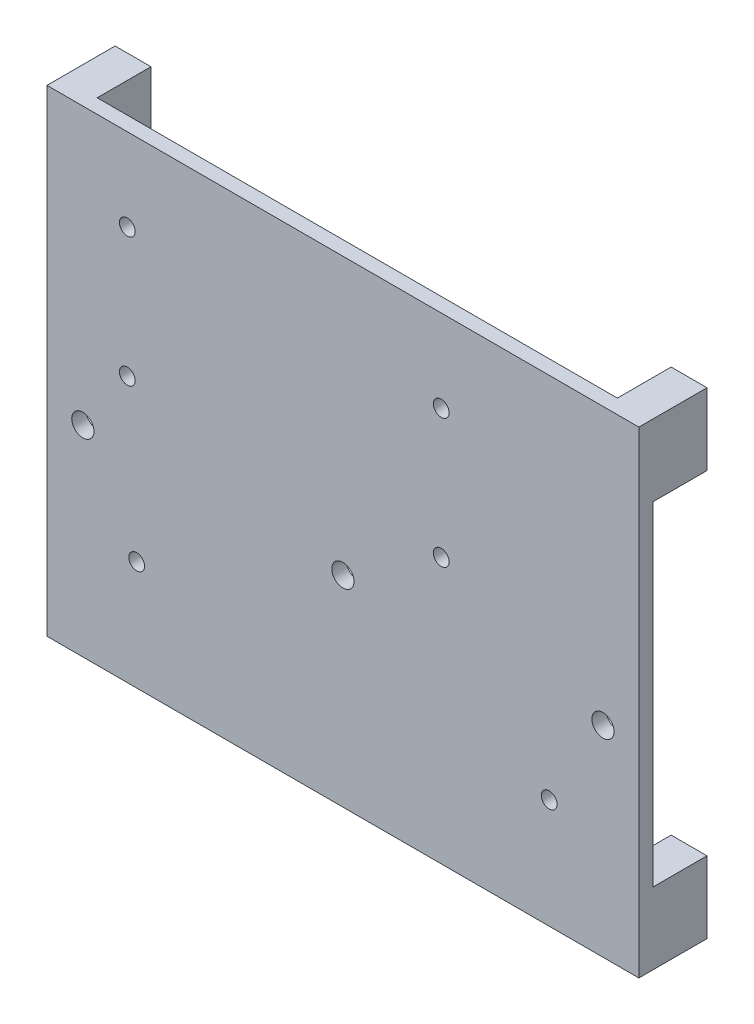
ISO-10303-21;
HEADER;
FILE_DESCRIPTION(('STEP AP214'),'2;1');
FILE_NAME('part.step','',(''),(''),'','','');
FILE_SCHEMA(('AUTOMOTIVE_DESIGN { 1 0 10303 214 1 1 1 1 }'));
ENDSEC;
DATA;
#1=APPLICATION_CONTEXT('core data for automotive mechanical design processes');
#2=APPLICATION_PROTOCOL_DEFINITION('international standard','automotive_design',2000,#1);
#3=PRODUCT_CONTEXT('',#1,'mechanical');
#4=PRODUCT('Part','Part','',(#3));
#5=PRODUCT_RELATED_PRODUCT_CATEGORY('part','',(#4));
#6=PRODUCT_DEFINITION_FORMATION('','',#4);
#7=PRODUCT_DEFINITION_CONTEXT('part definition',#1,'design');
#8=PRODUCT_DEFINITION('design','',#6,#7);
#9=PRODUCT_DEFINITION_SHAPE('','',#8);
#10=(LENGTH_UNIT() NAMED_UNIT(*) SI_UNIT(.MILLI.,.METRE.));
#11=(NAMED_UNIT(*) PLANE_ANGLE_UNIT() SI_UNIT($,.RADIAN.));
#12=(NAMED_UNIT(*) SI_UNIT($,.STERADIAN.) SOLID_ANGLE_UNIT());
#13=UNCERTAINTY_MEASURE_WITH_UNIT(LENGTH_MEASURE(1.E-05),#10,'distance_accuracy_value','');
#14=(GEOMETRIC_REPRESENTATION_CONTEXT(3) GLOBAL_UNCERTAINTY_ASSIGNED_CONTEXT((#13)) GLOBAL_UNIT_ASSIGNED_CONTEXT((#10,
#11,#12)) REPRESENTATION_CONTEXT('',''));
#15=CARTESIAN_POINT('',(0.,0.,0.));
#16=DIRECTION('',(0.,0.,1.));
#17=DIRECTION('',(1.,0.,0.));
#18=AXIS2_PLACEMENT_3D('',#15,#16,#17);
#19=CARTESIAN_POINT('',(0.,0.,0.));
#20=DIRECTION('',(0.,0.,-1.));
#21=DIRECTION('',(-1.,0.,0.));
#22=AXIS2_PLACEMENT_3D('',#19,#20,#21);
#23=PLANE('',#22);
#24=CARTESIAN_POINT('',(72.5,25.5,0.));
#25=DIRECTION('',(0.,0.,-1.));
#26=DIRECTION('',(-1.,0.,0.));
#27=AXIS2_PLACEMENT_3D('',#24,#25,#26);
#28=CIRCLE('',#27,3.1);
#29=CARTESIAN_POINT('',(69.4,25.5,0.));
#30=VERTEX_POINT('',#29);
#31=EDGE_CURVE('E625',#30,#30,#28,.T.);
#32=ORIENTED_EDGE('',*,*,#31,.F.);
#33=EDGE_LOOP('',(#32));
#34=FACE_BOUND('',#33,.T.);
#35=CARTESIAN_POINT('',(-72.5,25.5,0.));
#36=DIRECTION('',(0.,0.,-1.));
#37=DIRECTION('',(-1.,0.,0.));
#38=AXIS2_PLACEMENT_3D('',#35,#36,#37);
#39=CIRCLE('',#38,3.1);
#40=CARTESIAN_POINT('',(-75.6,25.5,0.));
#41=VERTEX_POINT('',#40);
#42=EDGE_CURVE('E632',#41,#41,#39,.T.);
#43=ORIENTED_EDGE('',*,*,#42,.F.);
#44=EDGE_LOOP('',(#43));
#45=FACE_BOUND('',#44,.T.);
#46=CARTESIAN_POINT('',(0.,25.5,0.));
#47=DIRECTION('',(0.,0.,-1.));
#48=DIRECTION('',(-1.,0.,0.));
#49=AXIS2_PLACEMENT_3D('',#46,#47,#48);
#50=CIRCLE('',#49,3.1);
#51=CARTESIAN_POINT('',(-3.09999999999999,25.5,0.));
#52=VERTEX_POINT('',#51);
#53=EDGE_CURVE('E636',#52,#52,#50,.T.);
#54=ORIENTED_EDGE('',*,*,#53,.F.);
#55=EDGE_LOOP('',(#54));
#56=FACE_BOUND('',#55,.T.);
#57=CARTESIAN_POINT('',(57.5,0.,0.));
#58=DIRECTION('',(0.,0.,-1.));
#59=DIRECTION('',(-1.,0.,0.));
#60=AXIS2_PLACEMENT_3D('',#57,#58,#59);
#61=CIRCLE('',#60,2.2);
#62=CARTESIAN_POINT('',(55.3,0.,0.));
#63=VERTEX_POINT('',#62);
#64=EDGE_CURVE('E257',#63,#63,#61,.T.);
#65=ORIENTED_EDGE('',*,*,#64,.F.);
#66=EDGE_LOOP('',(#65));
#67=FACE_BOUND('',#66,.T.);
#68=CARTESIAN_POINT('',(-60.1,43.5,0.));
#69=DIRECTION('',(0.,0.,-1.));
#70=DIRECTION('',(-1.,0.,0.));
#71=AXIS2_PLACEMENT_3D('',#68,#69,#70);
#72=CIRCLE('',#71,2.19999999999999);
#73=CARTESIAN_POINT('',(-62.3,43.5,0.));
#74=VERTEX_POINT('',#73);
#75=EDGE_CURVE('E276',#74,#74,#72,.T.);
#76=ORIENTED_EDGE('',*,*,#75,.F.);
#77=EDGE_LOOP('',(#76));
#78=FACE_BOUND('',#77,.T.);
#79=CARTESIAN_POINT('',(-60.1,79.5,0.));
#80=DIRECTION('',(0.,0.,-1.));
#81=DIRECTION('',(-1.,0.,0.));
#82=AXIS2_PLACEMENT_3D('',#79,#80,#81);
#83=CIRCLE('',#82,2.19999999999998);
#84=CARTESIAN_POINT('',(-62.3,79.5,0.));
#85=VERTEX_POINT('',#84);
#86=EDGE_CURVE('E261',#85,#85,#83,.T.);
#87=ORIENTED_EDGE('',*,*,#86,.F.);
#88=EDGE_LOOP('',(#87));
#89=FACE_BOUND('',#88,.T.);
#90=CARTESIAN_POINT('',(27.4,79.5,0.));
#91=DIRECTION('',(0.,0.,-1.));
#92=DIRECTION('',(-1.,0.,0.));
#93=AXIS2_PLACEMENT_3D('',#90,#91,#92);
#94=CIRCLE('',#93,2.20000000000001);
#95=CARTESIAN_POINT('',(25.2,79.5,0.));
#96=VERTEX_POINT('',#95);
#97=EDGE_CURVE('E262',#96,#96,#94,.T.);
#98=ORIENTED_EDGE('',*,*,#97,.F.);
#99=EDGE_LOOP('',(#98));
#100=FACE_BOUND('',#99,.T.);
#101=CARTESIAN_POINT('',(-57.5,0.,0.));
#102=DIRECTION('',(0.,0.,-1.));
#103=DIRECTION('',(-1.,0.,0.));
#104=AXIS2_PLACEMENT_3D('',#101,#102,#103);
#105=CIRCLE('',#104,2.2);
#106=CARTESIAN_POINT('',(-59.7,0.,0.));
#107=VERTEX_POINT('',#106);
#108=EDGE_CURVE('E268',#107,#107,#105,.T.);
#109=ORIENTED_EDGE('',*,*,#108,.F.);
#110=EDGE_LOOP('',(#109));
#111=FACE_BOUND('',#110,.T.);
#112=CARTESIAN_POINT('',(27.4,43.5,0.));
#113=DIRECTION('',(0.,0.,-1.));
#114=DIRECTION('',(-1.,0.,0.));
#115=AXIS2_PLACEMENT_3D('',#112,#113,#114);
#116=CIRCLE('',#115,2.19999999999998);
#117=CARTESIAN_POINT('',(25.2,43.5,0.));
#118=VERTEX_POINT('',#117);
#119=EDGE_CURVE('E275',#118,#118,#116,.T.);
#120=ORIENTED_EDGE('',*,*,#119,.F.);
#121=EDGE_LOOP('',(#120));
#122=FACE_BOUND('',#121,.T.);
#123=DIRECTION('',(-1.,0.,0.));
#124=VECTOR('',#123,1.);
#125=CARTESIAN_POINT('',(-82.5,82.5,0.));
#126=LINE('',#125,#124);
#127=CARTESIAN_POINT('',(-72.5,82.5,0.));
#128=VERTEX_POINT('',#127);
#129=CARTESIAN_POINT('',(-82.5,82.5,0.));
#130=VERTEX_POINT('',#129);
#131=EDGE_CURVE('E174',#128,#130,#126,.T.);
#132=ORIENTED_EDGE('',*,*,#131,.F.);
#133=DIRECTION('',(0.,-1.,0.));
#134=VECTOR('',#133,1.);
#135=CARTESIAN_POINT('',(-72.5,102.5,0.));
#136=LINE('',#135,#134);
#137=CARTESIAN_POINT('',(-72.5,102.5,0.));
#138=VERTEX_POINT('',#137);
#139=EDGE_CURVE('E176',#138,#128,#136,.T.);
#140=ORIENTED_EDGE('',*,*,#139,.F.);
#141=DIRECTION('',(-1.,0.,0.));
#142=VECTOR('',#141,1.);
#143=CARTESIAN_POINT('',(-82.5,102.5,0.));
#144=LINE('',#143,#142);
#145=CARTESIAN_POINT('',(72.5,102.5,0.));
#146=VERTEX_POINT('',#145);
#147=EDGE_CURVE('E296',#146,#138,#144,.T.);
#148=ORIENTED_EDGE('',*,*,#147,.F.);
#149=DIRECTION('',(0.,1.,0.));
#150=VECTOR('',#149,1.);
#151=CARTESIAN_POINT('',(72.5,102.5,0.));
#152=LINE('',#151,#150);
#153=CARTESIAN_POINT('',(72.5,82.5,0.));
#154=VERTEX_POINT('',#153);
#155=EDGE_CURVE('E218',#154,#146,#152,.T.);
#156=ORIENTED_EDGE('',*,*,#155,.F.);
#157=DIRECTION('',(-1.,0.,0.));
#158=VECTOR('',#157,1.);
#159=CARTESIAN_POINT('',(82.5,82.5,0.));
#160=LINE('',#159,#158);
#161=CARTESIAN_POINT('',(82.5,82.5,0.));
#162=VERTEX_POINT('',#161);
#163=EDGE_CURVE('E213',#162,#154,#160,.T.);
#164=ORIENTED_EDGE('',*,*,#163,.F.);
#165=DIRECTION('',(0.,1.,0.));
#166=VECTOR('',#165,1.);
#167=CARTESIAN_POINT('',(82.5,-30.5,0.));
#168=LINE('',#167,#166);
#169=CARTESIAN_POINT('',(82.5,-10.5,0.));
#170=VERTEX_POINT('',#169);
#171=EDGE_CURVE('E304',#170,#162,#168,.T.);
#172=ORIENTED_EDGE('',*,*,#171,.F.);
#173=DIRECTION('',(1.,0.,0.));
#174=VECTOR('',#173,1.);
#175=CARTESIAN_POINT('',(82.5,-10.5,0.));
#176=LINE('',#175,#174);
#177=CARTESIAN_POINT('',(72.5,-10.5,0.));
#178=VERTEX_POINT('',#177);
#179=EDGE_CURVE('E238',#178,#170,#176,.T.);
#180=ORIENTED_EDGE('',*,*,#179,.F.);
#181=DIRECTION('',(0.,1.,0.));
#182=VECTOR('',#181,1.);
#183=CARTESIAN_POINT('',(72.5,-30.5,0.));
#184=LINE('',#183,#182);
#185=CARTESIAN_POINT('',(72.5,-30.5,0.));
#186=VERTEX_POINT('',#185);
#187=EDGE_CURVE('E233',#186,#178,#184,.T.);
#188=ORIENTED_EDGE('',*,*,#187,.F.);
#189=DIRECTION('',(1.,0.,0.));
#190=VECTOR('',#189,1.);
#191=CARTESIAN_POINT('',(-82.5,-30.5,0.));
#192=LINE('',#191,#190);
#193=CARTESIAN_POINT('',(-72.5,-30.5,0.));
#194=VERTEX_POINT('',#193);
#195=EDGE_CURVE('E302',#194,#186,#192,.T.);
#196=ORIENTED_EDGE('',*,*,#195,.F.);
#197=DIRECTION('',(0.,-1.,0.));
#198=VECTOR('',#197,1.);
#199=CARTESIAN_POINT('',(-72.5,-30.5,0.));
#200=LINE('',#199,#198);
#201=CARTESIAN_POINT('',(-72.5,-10.5,0.));
#202=VERTEX_POINT('',#201);
#203=EDGE_CURVE('E197',#202,#194,#200,.T.);
#204=ORIENTED_EDGE('',*,*,#203,.F.);
#205=DIRECTION('',(1.,0.,0.));
#206=VECTOR('',#205,1.);
#207=CARTESIAN_POINT('',(-82.5,-10.5,0.));
#208=LINE('',#207,#206);
#209=CARTESIAN_POINT('',(-82.5,-10.5,0.));
#210=VERTEX_POINT('',#209);
#211=EDGE_CURVE('E192',#210,#202,#208,.T.);
#212=ORIENTED_EDGE('',*,*,#211,.F.);
#213=DIRECTION('',(0.,-1.,0.));
#214=VECTOR('',#213,1.);
#215=CARTESIAN_POINT('',(-82.5,-30.5,0.));
#216=LINE('',#215,#214);
#217=EDGE_CURVE('E291',#130,#210,#216,.T.);
#218=ORIENTED_EDGE('',*,*,#217,.F.);
#219=EDGE_LOOP('',(#132,#140,#148,#156,#164,#172,#180,#188,#196,#204,#212,#218));
#220=FACE_BOUND('',#219,.T.);
#221=ADVANCED_FACE('F34',(#34,#45,#56,#67,#78,#89,#100,#111,#122,#220),#23,.T.);
#222=CARTESIAN_POINT('',(-82.5,-30.5,4.));
#223=DIRECTION('',(1.,0.,0.));
#224=DIRECTION('',(0.,0.,-1.));
#225=AXIS2_PLACEMENT_3D('',#222,#223,#224);
#226=PLANE('',#225);
#227=DIRECTION('',(0.,0.,-1.));
#228=VECTOR('',#227,1.);
#229=CARTESIAN_POINT('',(-82.5,102.5,4.));
#230=LINE('',#229,#228);
#231=CARTESIAN_POINT('',(-82.5,102.5,4.));
#232=VERTEX_POINT('',#231);
#233=CARTESIAN_POINT('',(-82.5,102.5,-15.));
#234=VERTEX_POINT('',#233);
#235=EDGE_CURVE('E150',#232,#234,#230,.T.);
#236=ORIENTED_EDGE('',*,*,#235,.T.);
#237=DIRECTION('',(0.,1.,0.));
#238=VECTOR('',#237,1.);
#239=CARTESIAN_POINT('',(-82.5,102.5,-15.));
#240=LINE('',#239,#238);
#241=CARTESIAN_POINT('',(-82.5,82.5,-15.));
#242=VERTEX_POINT('',#241);
#243=EDGE_CURVE('E154',#242,#234,#240,.T.);
#244=ORIENTED_EDGE('',*,*,#243,.F.);
#245=DIRECTION('',(0.,0.,1.));
#246=VECTOR('',#245,1.);
#247=CARTESIAN_POINT('',(-82.5,82.5,-15.));
#248=LINE('',#247,#246);
#249=EDGE_CURVE('E184',#242,#130,#248,.T.);
#250=ORIENTED_EDGE('',*,*,#249,.T.);
#251=ORIENTED_EDGE('',*,*,#217,.T.);
#252=DIRECTION('',(0.,0.,1.));
#253=VECTOR('',#252,1.);
#254=CARTESIAN_POINT('',(-82.5,-10.5,-15.));
#255=LINE('',#254,#253);
#256=CARTESIAN_POINT('',(-82.5,-10.5,-15.));
#257=VERTEX_POINT('',#256);
#258=EDGE_CURVE('E210',#257,#210,#255,.T.);
#259=ORIENTED_EDGE('',*,*,#258,.F.);
#260=DIRECTION('',(0.,1.,0.));
#261=VECTOR('',#260,1.);
#262=CARTESIAN_POINT('',(-82.5,-30.5,-15.));
#263=LINE('',#262,#261);
#264=CARTESIAN_POINT('',(-82.5,-30.5,-15.));
#265=VERTEX_POINT('',#264);
#266=EDGE_CURVE('E193',#265,#257,#263,.T.);
#267=ORIENTED_EDGE('',*,*,#266,.F.);
#268=DIRECTION('',(0.,0.,-1.));
#269=VECTOR('',#268,1.);
#270=CARTESIAN_POINT('',(-82.5,-30.5,4.));
#271=LINE('',#270,#269);
#272=CARTESIAN_POINT('',(-82.5,-30.5,4.));
#273=VERTEX_POINT('',#272);
#274=EDGE_CURVE('E11',#273,#265,#271,.T.);
#275=ORIENTED_EDGE('',*,*,#274,.F.);
#276=DIRECTION('',(0.,-1.,0.));
#277=VECTOR('',#276,1.);
#278=CARTESIAN_POINT('',(-82.5,-30.5,4.));
#279=LINE('',#278,#277);
#280=EDGE_CURVE('E157',#232,#273,#279,.T.);
#281=ORIENTED_EDGE('',*,*,#280,.F.);
#282=EDGE_LOOP('',(#236,#244,#250,#251,#259,#267,#275,#281));
#283=FACE_BOUND('',#282,.T.);
#284=ADVANCED_FACE('F36',(#283),#226,.F.);
#285=CARTESIAN_POINT('',(-82.5,-30.5,4.));
#286=DIRECTION('',(0.,1.,0.));
#287=DIRECTION('',(0.,0.,1.));
#288=AXIS2_PLACEMENT_3D('',#285,#286,#287);
#289=PLANE('',#288);
#290=ORIENTED_EDGE('',*,*,#274,.T.);
#291=DIRECTION('',(-1.,0.,0.));
#292=VECTOR('',#291,1.);
#293=CARTESIAN_POINT('',(-82.5,-30.5,-15.));
#294=LINE('',#293,#292);
#295=CARTESIAN_POINT('',(-72.5,-30.5,-15.));
#296=VERTEX_POINT('',#295);
#297=EDGE_CURVE('E201',#296,#265,#294,.T.);
#298=ORIENTED_EDGE('',*,*,#297,.F.);
#299=DIRECTION('',(0.,0.,1.));
#300=VECTOR('',#299,1.);
#301=CARTESIAN_POINT('',(-72.5,-30.5,-15.));
#302=LINE('',#301,#300);
#303=EDGE_CURVE('E49',#296,#194,#302,.T.);
#304=ORIENTED_EDGE('',*,*,#303,.T.);
#305=ORIENTED_EDGE('',*,*,#195,.T.);
#306=DIRECTION('',(0.,0.,1.));
#307=VECTOR('',#306,1.);
#308=CARTESIAN_POINT('',(72.5,-30.5,-15.));
#309=LINE('',#308,#307);
#310=CARTESIAN_POINT('',(72.5,-30.5,-15.));
#311=VERTEX_POINT('',#310);
#312=EDGE_CURVE('E254',#311,#186,#309,.T.);
#313=ORIENTED_EDGE('',*,*,#312,.F.);
#314=DIRECTION('',(-1.,0.,0.));
#315=VECTOR('',#314,1.);
#316=CARTESIAN_POINT('',(82.5,-30.5,-15.));
#317=LINE('',#316,#315);
#318=CARTESIAN_POINT('',(82.5,-30.5,-15.));
#319=VERTEX_POINT('',#318);
#320=EDGE_CURVE('E237',#319,#311,#317,.T.);
#321=ORIENTED_EDGE('',*,*,#320,.F.);
#322=DIRECTION('',(0.,0.,-1.));
#323=VECTOR('',#322,1.);
#324=CARTESIAN_POINT('',(82.5,-30.5,4.));
#325=LINE('',#324,#323);
#326=CARTESIAN_POINT('',(82.5,-30.5,4.));
#327=VERTEX_POINT('',#326);
#328=EDGE_CURVE('E42',#327,#319,#325,.T.);
#329=ORIENTED_EDGE('',*,*,#328,.F.);
#330=DIRECTION('',(1.,0.,0.));
#331=VECTOR('',#330,1.);
#332=CARTESIAN_POINT('',(-82.5,-30.5,4.));
#333=LINE('',#332,#331);
#334=EDGE_CURVE('E295',#273,#327,#333,.T.);
#335=ORIENTED_EDGE('',*,*,#334,.F.);
#336=EDGE_LOOP('',(#290,#298,#304,#305,#313,#321,#329,#335));
#337=FACE_BOUND('',#336,.T.);
#338=ADVANCED_FACE('F316',(#337),#289,.F.);
#339=CARTESIAN_POINT('',(82.5,-30.5,4.));
#340=DIRECTION('',(-1.,0.,0.));
#341=DIRECTION('',(0.,0.,1.));
#342=AXIS2_PLACEMENT_3D('',#339,#340,#341);
#343=PLANE('',#342);
#344=ORIENTED_EDGE('',*,*,#328,.T.);
#345=DIRECTION('',(0.,-1.,0.));
#346=VECTOR('',#345,1.);
#347=CARTESIAN_POINT('',(82.5,-30.5,-15.));
#348=LINE('',#347,#346);
#349=CARTESIAN_POINT('',(82.5,-10.5,-15.));
#350=VERTEX_POINT('',#349);
#351=EDGE_CURVE('E234',#350,#319,#348,.T.);
#352=ORIENTED_EDGE('',*,*,#351,.F.);
#353=DIRECTION('',(0.,0.,1.));
#354=VECTOR('',#353,1.);
#355=CARTESIAN_POINT('',(82.5,-10.5,-15.));
#356=LINE('',#355,#354);
#357=EDGE_CURVE('E244',#350,#170,#356,.T.);
#358=ORIENTED_EDGE('',*,*,#357,.T.);
#359=ORIENTED_EDGE('',*,*,#171,.T.);
#360=DIRECTION('',(0.,0.,1.));
#361=VECTOR('',#360,1.);
#362=CARTESIAN_POINT('',(82.5,82.5,-15.));
#363=LINE('',#362,#361);
#364=CARTESIAN_POINT('',(82.5,82.5,-15.));
#365=VERTEX_POINT('',#364);
#366=EDGE_CURVE('E231',#365,#162,#363,.T.);
#367=ORIENTED_EDGE('',*,*,#366,.F.);
#368=DIRECTION('',(0.,-1.,0.));
#369=VECTOR('',#368,1.);
#370=CARTESIAN_POINT('',(82.5,102.5,-15.));
#371=LINE('',#370,#369);
#372=CARTESIAN_POINT('',(82.5,102.5,-15.));
#373=VERTEX_POINT('',#372);
#374=EDGE_CURVE('E214',#373,#365,#371,.T.);
#375=ORIENTED_EDGE('',*,*,#374,.F.);
#376=DIRECTION('',(0.,0.,-1.));
#377=VECTOR('',#376,1.);
#378=CARTESIAN_POINT('',(82.5,102.5,4.));
#379=LINE('',#378,#377);
#380=CARTESIAN_POINT('',(82.5,102.5,4.));
#381=VERTEX_POINT('',#380);
#382=EDGE_CURVE('E159',#381,#373,#379,.T.);
#383=ORIENTED_EDGE('',*,*,#382,.F.);
#384=DIRECTION('',(0.,1.,0.));
#385=VECTOR('',#384,1.);
#386=CARTESIAN_POINT('',(82.5,-30.5,4.));
#387=LINE('',#386,#385);
#388=EDGE_CURVE('E298',#327,#381,#387,.T.);
#389=ORIENTED_EDGE('',*,*,#388,.F.);
#390=EDGE_LOOP('',(#344,#352,#358,#359,#367,#375,#383,#389));
#391=FACE_BOUND('',#390,.T.);
#392=ADVANCED_FACE('F313',(#391),#343,.F.);
#393=CARTESIAN_POINT('',(-82.5,102.5,4.));
#394=DIRECTION('',(0.,-1.,0.));
#395=DIRECTION('',(0.,0.,-1.));
#396=AXIS2_PLACEMENT_3D('',#393,#394,#395);
#397=PLANE('',#396);
#398=ORIENTED_EDGE('',*,*,#382,.T.);
#399=DIRECTION('',(1.,0.,0.));
#400=VECTOR('',#399,1.);
#401=CARTESIAN_POINT('',(82.5,102.5,-15.));
#402=LINE('',#401,#400);
#403=CARTESIAN_POINT('',(72.5,102.5,-15.));
#404=VERTEX_POINT('',#403);
#405=EDGE_CURVE('E222',#404,#373,#402,.T.);
#406=ORIENTED_EDGE('',*,*,#405,.F.);
#407=DIRECTION('',(0.,0.,1.));
#408=VECTOR('',#407,1.);
#409=CARTESIAN_POINT('',(72.5,102.5,-15.));
#410=LINE('',#409,#408);
#411=EDGE_CURVE('E57',#404,#146,#410,.T.);
#412=ORIENTED_EDGE('',*,*,#411,.T.);
#413=ORIENTED_EDGE('',*,*,#147,.T.);
#414=DIRECTION('',(0.,0.,1.));
#415=VECTOR('',#414,1.);
#416=CARTESIAN_POINT('',(-72.5,102.5,-15.));
#417=LINE('',#416,#415);
#418=CARTESIAN_POINT('',(-72.5,102.5,-15.));
#419=VERTEX_POINT('',#418);
#420=EDGE_CURVE('E165',#419,#138,#417,.T.);
#421=ORIENTED_EDGE('',*,*,#420,.F.);
#422=DIRECTION('',(1.,0.,0.));
#423=VECTOR('',#422,1.);
#424=CARTESIAN_POINT('',(-82.5,102.5,-15.));
#425=LINE('',#424,#423);
#426=EDGE_CURVE('E163',#234,#419,#425,.T.);
#427=ORIENTED_EDGE('',*,*,#426,.F.);
#428=ORIENTED_EDGE('',*,*,#235,.F.);
#429=DIRECTION('',(-1.,0.,0.));
#430=VECTOR('',#429,1.);
#431=CARTESIAN_POINT('',(-82.5,102.5,4.));
#432=LINE('',#431,#430);
#433=EDGE_CURVE('E160',#381,#232,#432,.T.);
#434=ORIENTED_EDGE('',*,*,#433,.F.);
#435=EDGE_LOOP('',(#398,#406,#412,#413,#421,#427,#428,#434));
#436=FACE_BOUND('',#435,.T.);
#437=ADVANCED_FACE('F164',(#436),#397,.F.);
#438=CARTESIAN_POINT('',(0.,0.,4.));
#439=DIRECTION('',(0.,0.,-1.));
#440=DIRECTION('',(-1.,0.,0.));
#441=AXIS2_PLACEMENT_3D('',#438,#439,#440);
#442=PLANE('',#441);
#443=CARTESIAN_POINT('',(72.5,25.5,4.));
#444=DIRECTION('',(0.,0.,-1.));
#445=DIRECTION('',(-1.,0.,0.));
#446=AXIS2_PLACEMENT_3D('',#443,#444,#445);
#447=CIRCLE('',#446,3.1);
#448=CARTESIAN_POINT('',(69.4,25.5,4.));
#449=VERTEX_POINT('',#448);
#450=EDGE_CURVE('E185',#449,#449,#447,.F.);
#451=ORIENTED_EDGE('',*,*,#450,.F.);
#452=EDGE_LOOP('',(#451));
#453=FACE_BOUND('',#452,.T.);
#454=CARTESIAN_POINT('',(-72.5,25.5,4.));
#455=DIRECTION('',(0.,0.,-1.));
#456=DIRECTION('',(-1.,0.,0.));
#457=AXIS2_PLACEMENT_3D('',#454,#455,#456);
#458=CIRCLE('',#457,3.1);
#459=CARTESIAN_POINT('',(-75.6,25.5,4.));
#460=VERTEX_POINT('',#459);
#461=EDGE_CURVE('E629',#460,#460,#458,.F.);
#462=ORIENTED_EDGE('',*,*,#461,.F.);
#463=EDGE_LOOP('',(#462));
#464=FACE_BOUND('',#463,.T.);
#465=CARTESIAN_POINT('',(0.,25.5,4.));
#466=DIRECTION('',(0.,0.,-1.));
#467=DIRECTION('',(-1.,0.,0.));
#468=AXIS2_PLACEMENT_3D('',#465,#466,#467);
#469=CIRCLE('',#468,3.1);
#470=CARTESIAN_POINT('',(-3.09999999999999,25.5,4.));
#471=VERTEX_POINT('',#470);
#472=EDGE_CURVE('E179',#471,#471,#469,.F.);
#473=ORIENTED_EDGE('',*,*,#472,.F.);
#474=EDGE_LOOP('',(#473));
#475=FACE_BOUND('',#474,.T.);
#476=CARTESIAN_POINT('',(57.5,0.,4.));
#477=DIRECTION('',(0.,0.,-1.));
#478=DIRECTION('',(-1.,0.,0.));
#479=AXIS2_PLACEMENT_3D('',#476,#477,#478);
#480=CIRCLE('',#479,2.2);
#481=CARTESIAN_POINT('',(55.3,0.,4.));
#482=VERTEX_POINT('',#481);
#483=EDGE_CURVE('E271',#482,#482,#480,.T.);
#484=ORIENTED_EDGE('',*,*,#483,.T.);
#485=EDGE_LOOP('',(#484));
#486=FACE_BOUND('',#485,.T.);
#487=CARTESIAN_POINT('',(-60.1,43.5,4.));
#488=DIRECTION('',(0.,0.,-1.));
#489=DIRECTION('',(-1.,0.,0.));
#490=AXIS2_PLACEMENT_3D('',#487,#488,#489);
#491=CIRCLE('',#490,2.19999999999999);
#492=CARTESIAN_POINT('',(-62.3,43.5,4.));
#493=VERTEX_POINT('',#492);
#494=EDGE_CURVE('E272',#493,#493,#491,.T.);
#495=ORIENTED_EDGE('',*,*,#494,.T.);
#496=EDGE_LOOP('',(#495));
#497=FACE_BOUND('',#496,.T.);
#498=CARTESIAN_POINT('',(-60.1,79.5,4.));
#499=DIRECTION('',(0.,0.,-1.));
#500=DIRECTION('',(-1.,0.,0.));
#501=AXIS2_PLACEMENT_3D('',#498,#499,#500);
#502=CIRCLE('',#501,2.19999999999998);
#503=CARTESIAN_POINT('',(-62.3,79.5,4.));
#504=VERTEX_POINT('',#503);
#505=EDGE_CURVE('E279',#504,#504,#502,.T.);
#506=ORIENTED_EDGE('',*,*,#505,.T.);
#507=EDGE_LOOP('',(#506));
#508=FACE_BOUND('',#507,.T.);
#509=CARTESIAN_POINT('',(27.4,79.5,4.));
#510=DIRECTION('',(0.,0.,-1.));
#511=DIRECTION('',(-1.,0.,0.));
#512=AXIS2_PLACEMENT_3D('',#509,#510,#511);
#513=CIRCLE('',#512,2.20000000000001);
#514=CARTESIAN_POINT('',(25.2,79.5,4.));
#515=VERTEX_POINT('',#514);
#516=EDGE_CURVE('E258',#515,#515,#513,.T.);
#517=ORIENTED_EDGE('',*,*,#516,.T.);
#518=EDGE_LOOP('',(#517));
#519=FACE_BOUND('',#518,.T.);
#520=CARTESIAN_POINT('',(-57.5,0.,4.));
#521=DIRECTION('',(0.,0.,-1.));
#522=DIRECTION('',(-1.,0.,0.));
#523=AXIS2_PLACEMENT_3D('',#520,#521,#522);
#524=CIRCLE('',#523,2.2);
#525=CARTESIAN_POINT('',(-59.7,0.,4.));
#526=VERTEX_POINT('',#525);
#527=EDGE_CURVE('E265',#526,#526,#524,.T.);
#528=ORIENTED_EDGE('',*,*,#527,.T.);
#529=EDGE_LOOP('',(#528));
#530=FACE_BOUND('',#529,.T.);
#531=CARTESIAN_POINT('',(27.4,43.5,4.));
#532=DIRECTION('',(0.,0.,-1.));
#533=DIRECTION('',(-1.,0.,0.));
#534=AXIS2_PLACEMENT_3D('',#531,#532,#533);
#535=CIRCLE('',#534,2.19999999999998);
#536=CARTESIAN_POINT('',(25.2,43.5,4.));
#537=VERTEX_POINT('',#536);
#538=EDGE_CURVE('E288',#537,#537,#535,.T.);
#539=ORIENTED_EDGE('',*,*,#538,.T.);
#540=EDGE_LOOP('',(#539));
#541=FACE_BOUND('',#540,.T.);
#542=ORIENTED_EDGE('',*,*,#280,.T.);
#543=ORIENTED_EDGE('',*,*,#334,.T.);
#544=ORIENTED_EDGE('',*,*,#388,.T.);
#545=ORIENTED_EDGE('',*,*,#433,.T.);
#546=EDGE_LOOP('',(#542,#543,#544,#545));
#547=FACE_BOUND('',#546,.T.);
#548=ADVANCED_FACE('F342',(#453,#464,#475,#486,#497,#508,#519,#530,#541,#547),#442,.F.);
#549=CARTESIAN_POINT('',(27.4,43.5,4.));
#550=DIRECTION('',(0.,0.,-1.));
#551=DIRECTION('',(-1.,0.,0.));
#552=AXIS2_PLACEMENT_3D('',#549,#550,#551);
#553=CYLINDRICAL_SURFACE('',#552,2.19999999999998);
#554=ORIENTED_EDGE('',*,*,#538,.F.);
#555=EDGE_LOOP('',(#554));
#556=FACE_BOUND('',#555,.T.);
#557=ORIENTED_EDGE('',*,*,#119,.T.);
#558=EDGE_LOOP('',(#557));
#559=FACE_BOUND('',#558,.T.);
#560=ADVANCED_FACE('F400',(#556,#559),#553,.F.);
#561=CARTESIAN_POINT('',(-57.5,0.,4.));
#562=DIRECTION('',(0.,0.,-1.));
#563=DIRECTION('',(-1.,0.,0.));
#564=AXIS2_PLACEMENT_3D('',#561,#562,#563);
#565=CYLINDRICAL_SURFACE('',#564,2.2);
#566=ORIENTED_EDGE('',*,*,#527,.F.);
#567=EDGE_LOOP('',(#566));
#568=FACE_BOUND('',#567,.T.);
#569=ORIENTED_EDGE('',*,*,#108,.T.);
#570=EDGE_LOOP('',(#569));
#571=FACE_BOUND('',#570,.T.);
#572=ADVANCED_FACE('F408',(#568,#571),#565,.F.);
#573=CARTESIAN_POINT('',(27.4,79.5,4.));
#574=DIRECTION('',(0.,0.,-1.));
#575=DIRECTION('',(-1.,0.,0.));
#576=AXIS2_PLACEMENT_3D('',#573,#574,#575);
#577=CYLINDRICAL_SURFACE('',#576,2.20000000000001);
#578=ORIENTED_EDGE('',*,*,#516,.F.);
#579=EDGE_LOOP('',(#578));
#580=FACE_BOUND('',#579,.T.);
#581=ORIENTED_EDGE('',*,*,#97,.T.);
#582=EDGE_LOOP('',(#581));
#583=FACE_BOUND('',#582,.T.);
#584=ADVANCED_FACE('F415',(#580,#583),#577,.F.);
#585=CARTESIAN_POINT('',(-60.1,79.5,4.));
#586=DIRECTION('',(0.,0.,-1.));
#587=DIRECTION('',(-1.,0.,0.));
#588=AXIS2_PLACEMENT_3D('',#585,#586,#587);
#589=CYLINDRICAL_SURFACE('',#588,2.19999999999998);
#590=ORIENTED_EDGE('',*,*,#505,.F.);
#591=EDGE_LOOP('',(#590));
#592=FACE_BOUND('',#591,.T.);
#593=ORIENTED_EDGE('',*,*,#86,.T.);
#594=EDGE_LOOP('',(#593));
#595=FACE_BOUND('',#594,.T.);
#596=ADVANCED_FACE('F423',(#592,#595),#589,.F.);
#597=CARTESIAN_POINT('',(-60.1,43.5,4.));
#598=DIRECTION('',(0.,0.,-1.));
#599=DIRECTION('',(-1.,0.,0.));
#600=AXIS2_PLACEMENT_3D('',#597,#598,#599);
#601=CYLINDRICAL_SURFACE('',#600,2.19999999999999);
#602=ORIENTED_EDGE('',*,*,#494,.F.);
#603=EDGE_LOOP('',(#602));
#604=FACE_BOUND('',#603,.T.);
#605=ORIENTED_EDGE('',*,*,#75,.T.);
#606=EDGE_LOOP('',(#605));
#607=FACE_BOUND('',#606,.T.);
#608=ADVANCED_FACE('F431',(#604,#607),#601,.F.);
#609=CARTESIAN_POINT('',(57.5,0.,4.));
#610=DIRECTION('',(0.,0.,-1.));
#611=DIRECTION('',(-1.,0.,0.));
#612=AXIS2_PLACEMENT_3D('',#609,#610,#611);
#613=CYLINDRICAL_SURFACE('',#612,2.2);
#614=ORIENTED_EDGE('',*,*,#483,.F.);
#615=EDGE_LOOP('',(#614));
#616=FACE_BOUND('',#615,.T.);
#617=ORIENTED_EDGE('',*,*,#64,.T.);
#618=EDGE_LOOP('',(#617));
#619=FACE_BOUND('',#618,.T.);
#620=ADVANCED_FACE('F439',(#616,#619),#613,.F.);
#621=CARTESIAN_POINT('',(72.5,-30.5,-15.));
#622=DIRECTION('',(1.,0.,0.));
#623=DIRECTION('',(0.,0.,-1.));
#624=AXIS2_PLACEMENT_3D('',#621,#622,#623);
#625=PLANE('',#624);
#626=ORIENTED_EDGE('',*,*,#187,.T.);
#627=DIRECTION('',(0.,0.,1.));
#628=VECTOR('',#627,1.);
#629=CARTESIAN_POINT('',(72.5,-10.5,-15.));
#630=LINE('',#629,#628);
#631=CARTESIAN_POINT('',(72.5,-10.5,-15.));
#632=VERTEX_POINT('',#631);
#633=EDGE_CURVE('E251',#632,#178,#630,.T.);
#634=ORIENTED_EDGE('',*,*,#633,.F.);
#635=DIRECTION('',(0.,1.,0.));
#636=VECTOR('',#635,1.);
#637=CARTESIAN_POINT('',(72.5,-30.5,-15.));
#638=LINE('',#637,#636);
#639=EDGE_CURVE('E240',#311,#632,#638,.T.);
#640=ORIENTED_EDGE('',*,*,#639,.F.);
#641=ORIENTED_EDGE('',*,*,#312,.T.);
#642=EDGE_LOOP('',(#626,#634,#640,#641));
#643=FACE_BOUND('',#642,.T.);
#644=ADVANCED_FACE('F447',(#643),#625,.F.);
#645=CARTESIAN_POINT('',(82.5,-10.5,-15.));
#646=DIRECTION('',(0.,-1.,0.));
#647=DIRECTION('',(0.,0.,-1.));
#648=AXIS2_PLACEMENT_3D('',#645,#646,#647);
#649=PLANE('',#648);
#650=ORIENTED_EDGE('',*,*,#179,.T.);
#651=ORIENTED_EDGE('',*,*,#357,.F.);
#652=DIRECTION('',(1.,0.,0.));
#653=VECTOR('',#652,1.);
#654=CARTESIAN_POINT('',(82.5,-10.5,-15.));
#655=LINE('',#654,#653);
#656=EDGE_CURVE('E242',#632,#350,#655,.T.);
#657=ORIENTED_EDGE('',*,*,#656,.F.);
#658=ORIENTED_EDGE('',*,*,#633,.T.);
#659=EDGE_LOOP('',(#650,#651,#657,#658));
#660=FACE_BOUND('',#659,.T.);
#661=ADVANCED_FACE('F324',(#660),#649,.F.);
#662=CARTESIAN_POINT('',(0.,0.,-15.));
#663=DIRECTION('',(0.,0.,1.));
#664=DIRECTION('',(1.,0.,0.));
#665=AXIS2_PLACEMENT_3D('',#662,#663,#664);
#666=PLANE('',#665);
#667=ORIENTED_EDGE('',*,*,#351,.T.);
#668=ORIENTED_EDGE('',*,*,#320,.T.);
#669=ORIENTED_EDGE('',*,*,#639,.T.);
#670=ORIENTED_EDGE('',*,*,#656,.T.);
#671=EDGE_LOOP('',(#667,#668,#669,#670));
#672=FACE_BOUND('',#671,.T.);
#673=ADVANCED_FACE('F319',(#672),#666,.F.);
#674=CARTESIAN_POINT('',(82.5,82.5,-15.));
#675=DIRECTION('',(0.,1.,0.));
#676=DIRECTION('',(-1.,0.,0.));
#677=AXIS2_PLACEMENT_3D('',#674,#675,#676);
#678=PLANE('',#677);
#679=ORIENTED_EDGE('',*,*,#163,.T.);
#680=DIRECTION('',(0.,0.,1.));
#681=VECTOR('',#680,1.);
#682=CARTESIAN_POINT('',(72.5,82.5,-15.));
#683=LINE('',#682,#681);
#684=CARTESIAN_POINT('',(72.5,82.5,-15.));
#685=VERTEX_POINT('',#684);
#686=EDGE_CURVE('E228',#685,#154,#683,.T.);
#687=ORIENTED_EDGE('',*,*,#686,.F.);
#688=DIRECTION('',(-1.,0.,0.));
#689=VECTOR('',#688,1.);
#690=CARTESIAN_POINT('',(82.5,82.5,-15.));
#691=LINE('',#690,#689);
#692=EDGE_CURVE('E217',#365,#685,#691,.T.);
#693=ORIENTED_EDGE('',*,*,#692,.F.);
#694=ORIENTED_EDGE('',*,*,#366,.T.);
#695=EDGE_LOOP('',(#679,#687,#693,#694));
#696=FACE_BOUND('',#695,.T.);
#697=ADVANCED_FACE('F335',(#696),#678,.F.);
#698=CARTESIAN_POINT('',(72.5,102.5,-15.));
#699=DIRECTION('',(1.,0.,0.));
#700=DIRECTION('',(0.,0.,-1.));
#701=AXIS2_PLACEMENT_3D('',#698,#699,#700);
#702=PLANE('',#701);
#703=ORIENTED_EDGE('',*,*,#155,.T.);
#704=ORIENTED_EDGE('',*,*,#411,.F.);
#705=DIRECTION('',(0.,1.,0.));
#706=VECTOR('',#705,1.);
#707=CARTESIAN_POINT('',(72.5,102.5,-15.));
#708=LINE('',#707,#706);
#709=EDGE_CURVE('E220',#685,#404,#708,.T.);
#710=ORIENTED_EDGE('',*,*,#709,.F.);
#711=ORIENTED_EDGE('',*,*,#686,.T.);
#712=EDGE_LOOP('',(#703,#704,#710,#711));
#713=FACE_BOUND('',#712,.T.);
#714=ADVANCED_FACE('F338',(#713),#702,.F.);
#715=CARTESIAN_POINT('',(0.,0.,-15.));
#716=DIRECTION('',(0.,0.,-1.));
#717=DIRECTION('',(-1.,0.,0.));
#718=AXIS2_PLACEMENT_3D('',#715,#716,#717);
#719=PLANE('',#718);
#720=ORIENTED_EDGE('',*,*,#374,.T.);
#721=ORIENTED_EDGE('',*,*,#692,.T.);
#722=ORIENTED_EDGE('',*,*,#709,.T.);
#723=ORIENTED_EDGE('',*,*,#405,.T.);
#724=EDGE_LOOP('',(#720,#721,#722,#723));
#725=FACE_BOUND('',#724,.T.);
#726=ADVANCED_FACE('F340',(#725),#719,.T.);
#727=CARTESIAN_POINT('',(-82.5,-10.5,-15.));
#728=DIRECTION('',(0.,-1.,0.));
#729=DIRECTION('',(1.,0.,0.));
#730=AXIS2_PLACEMENT_3D('',#727,#728,#729);
#731=PLANE('',#730);
#732=ORIENTED_EDGE('',*,*,#211,.T.);
#733=DIRECTION('',(0.,0.,1.));
#734=VECTOR('',#733,1.);
#735=CARTESIAN_POINT('',(-72.5,-10.5,-15.));
#736=LINE('',#735,#734);
#737=CARTESIAN_POINT('',(-72.5,-10.5,-15.));
#738=VERTEX_POINT('',#737);
#739=EDGE_CURVE('E207',#738,#202,#736,.T.);
#740=ORIENTED_EDGE('',*,*,#739,.F.);
#741=DIRECTION('',(1.,0.,0.));
#742=VECTOR('',#741,1.);
#743=CARTESIAN_POINT('',(-82.5,-10.5,-15.));
#744=LINE('',#743,#742);
#745=EDGE_CURVE('E196',#257,#738,#744,.T.);
#746=ORIENTED_EDGE('',*,*,#745,.F.);
#747=ORIENTED_EDGE('',*,*,#258,.T.);
#748=EDGE_LOOP('',(#732,#740,#746,#747));
#749=FACE_BOUND('',#748,.T.);
#750=ADVANCED_FACE('F351',(#749),#731,.F.);
#751=CARTESIAN_POINT('',(-72.5,-30.5,-15.));
#752=DIRECTION('',(-1.,0.,0.));
#753=DIRECTION('',(0.,0.,1.));
#754=AXIS2_PLACEMENT_3D('',#751,#752,#753);
#755=PLANE('',#754);
#756=ORIENTED_EDGE('',*,*,#203,.T.);
#757=ORIENTED_EDGE('',*,*,#303,.F.);
#758=DIRECTION('',(0.,-1.,0.));
#759=VECTOR('',#758,1.);
#760=CARTESIAN_POINT('',(-72.5,-30.5,-15.));
#761=LINE('',#760,#759);
#762=EDGE_CURVE('E199',#738,#296,#761,.T.);
#763=ORIENTED_EDGE('',*,*,#762,.F.);
#764=ORIENTED_EDGE('',*,*,#739,.T.);
#765=EDGE_LOOP('',(#756,#757,#763,#764));
#766=FACE_BOUND('',#765,.T.);
#767=ADVANCED_FACE('F356',(#766),#755,.F.);
#768=CARTESIAN_POINT('',(0.,0.,-15.));
#769=DIRECTION('',(0.,0.,-1.));
#770=DIRECTION('',(-1.,0.,0.));
#771=AXIS2_PLACEMENT_3D('',#768,#769,#770);
#772=PLANE('',#771);
#773=ORIENTED_EDGE('',*,*,#266,.T.);
#774=ORIENTED_EDGE('',*,*,#745,.T.);
#775=ORIENTED_EDGE('',*,*,#762,.T.);
#776=ORIENTED_EDGE('',*,*,#297,.T.);
#777=EDGE_LOOP('',(#773,#774,#775,#776));
#778=FACE_BOUND('',#777,.T.);
#779=ADVANCED_FACE('F345',(#778),#772,.T.);
#780=CARTESIAN_POINT('',(-72.5,102.5,-15.));
#781=DIRECTION('',(-1.,0.,0.));
#782=DIRECTION('',(0.,0.,1.));
#783=AXIS2_PLACEMENT_3D('',#780,#781,#782);
#784=PLANE('',#783);
#785=ORIENTED_EDGE('',*,*,#139,.T.);
#786=DIRECTION('',(0.,0.,1.));
#787=VECTOR('',#786,1.);
#788=CARTESIAN_POINT('',(-72.5,82.5,-15.));
#789=LINE('',#788,#787);
#790=CARTESIAN_POINT('',(-72.5,82.5,-15.));
#791=VERTEX_POINT('',#790);
#792=EDGE_CURVE('E188',#791,#128,#789,.T.);
#793=ORIENTED_EDGE('',*,*,#792,.F.);
#794=DIRECTION('',(0.,-1.,0.));
#795=VECTOR('',#794,1.);
#796=CARTESIAN_POINT('',(-72.5,102.5,-15.));
#797=LINE('',#796,#795);
#798=EDGE_CURVE('E168',#419,#791,#797,.T.);
#799=ORIENTED_EDGE('',*,*,#798,.F.);
#800=ORIENTED_EDGE('',*,*,#420,.T.);
#801=EDGE_LOOP('',(#785,#793,#799,#800));
#802=FACE_BOUND('',#801,.T.);
#803=ADVANCED_FACE('F363',(#802),#784,.F.);
#804=CARTESIAN_POINT('',(-82.5,82.5,-15.));
#805=DIRECTION('',(0.,1.,0.));
#806=DIRECTION('',(-1.,0.,0.));
#807=AXIS2_PLACEMENT_3D('',#804,#805,#806);
#808=PLANE('',#807);
#809=ORIENTED_EDGE('',*,*,#131,.T.);
#810=ORIENTED_EDGE('',*,*,#249,.F.);
#811=DIRECTION('',(-1.,0.,0.));
#812=VECTOR('',#811,1.);
#813=CARTESIAN_POINT('',(-82.5,82.5,-15.));
#814=LINE('',#813,#812);
#815=EDGE_CURVE('E172',#791,#242,#814,.T.);
#816=ORIENTED_EDGE('',*,*,#815,.F.);
#817=ORIENTED_EDGE('',*,*,#792,.T.);
#818=EDGE_LOOP('',(#809,#810,#816,#817));
#819=FACE_BOUND('',#818,.T.);
#820=ADVANCED_FACE('F508',(#819),#808,.F.);
#821=CARTESIAN_POINT('',(0.,0.,-15.));
#822=DIRECTION('',(0.,0.,1.));
#823=DIRECTION('',(1.,0.,0.));
#824=AXIS2_PLACEMENT_3D('',#821,#822,#823);
#825=PLANE('',#824);
#826=ORIENTED_EDGE('',*,*,#243,.T.);
#827=ORIENTED_EDGE('',*,*,#426,.T.);
#828=ORIENTED_EDGE('',*,*,#798,.T.);
#829=ORIENTED_EDGE('',*,*,#815,.T.);
#830=EDGE_LOOP('',(#826,#827,#828,#829));
#831=FACE_BOUND('',#830,.T.);
#832=ADVANCED_FACE('F170',(#831),#825,.F.);
#833=CARTESIAN_POINT('',(0.,25.5,4.001));
#834=DIRECTION('',(0.,0.,-1.));
#835=DIRECTION('',(-1.,0.,0.));
#836=AXIS2_PLACEMENT_3D('',#833,#834,#835);
#837=CYLINDRICAL_SURFACE('',#836,3.1);
#838=ORIENTED_EDGE('',*,*,#53,.T.);
#839=EDGE_LOOP('',(#838));
#840=FACE_BOUND('',#839,.T.);
#841=ORIENTED_EDGE('',*,*,#472,.T.);
#842=EDGE_LOOP('',(#841));
#843=FACE_BOUND('',#842,.T.);
#844=ADVANCED_FACE('F526',(#840,#843),#837,.F.);
#845=CARTESIAN_POINT('',(-72.5,25.5,4.001));
#846=DIRECTION('',(0.,0.,-1.));
#847=DIRECTION('',(-1.,0.,0.));
#848=AXIS2_PLACEMENT_3D('',#845,#846,#847);
#849=CYLINDRICAL_SURFACE('',#848,3.1);
#850=ORIENTED_EDGE('',*,*,#42,.T.);
#851=EDGE_LOOP('',(#850));
#852=FACE_BOUND('',#851,.T.);
#853=ORIENTED_EDGE('',*,*,#461,.T.);
#854=EDGE_LOOP('',(#853));
#855=FACE_BOUND('',#854,.T.);
#856=ADVANCED_FACE('F599',(#852,#855),#849,.F.);
#857=CARTESIAN_POINT('',(72.5,25.5,4.001));
#858=DIRECTION('',(0.,0.,-1.));
#859=DIRECTION('',(-1.,0.,0.));
#860=AXIS2_PLACEMENT_3D('',#857,#858,#859);
#861=CYLINDRICAL_SURFACE('',#860,3.1);
#862=ORIENTED_EDGE('',*,*,#31,.T.);
#863=EDGE_LOOP('',(#862));
#864=FACE_BOUND('',#863,.T.);
#865=ORIENTED_EDGE('',*,*,#450,.T.);
#866=EDGE_LOOP('',(#865));
#867=FACE_BOUND('',#866,.T.);
#868=ADVANCED_FACE('F606',(#864,#867),#861,.F.);
#869=CLOSED_SHELL('',(#221,#284,#338,#392,#437,#548,#560,#572,#584,#596,#608,#620,#644,#661,
#673,#697,#714,#726,#750,#767,#779,#803,#820,#832,#844,#856,#868));
#870=MANIFOLD_SOLID_BREP('B2',#869);
#871=ADVANCED_BREP_SHAPE_REPRESENTATION('',(#18,#870),#14);
#872=SHAPE_DEFINITION_REPRESENTATION(#9,#871);
ENDSEC;
END-ISO-10303-21;
